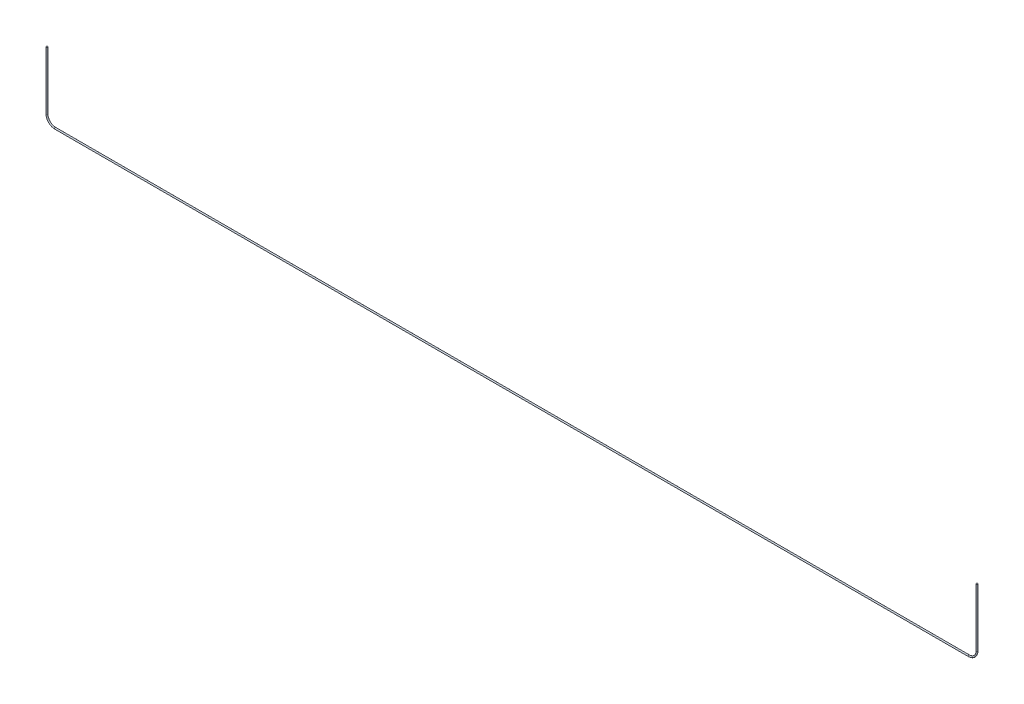
ISO-10303-21;
HEADER;
FILE_DESCRIPTION(('STEP AP214'),'2;1');
FILE_NAME('part.step','',(''),(''),'','','');
FILE_SCHEMA(('AUTOMOTIVE_DESIGN { 1 0 10303 214 1 1 1 1 }'));
ENDSEC;
DATA;
#1=APPLICATION_CONTEXT('core data for automotive mechanical design processes');
#2=APPLICATION_PROTOCOL_DEFINITION('international standard','automotive_design',2000,#1);
#3=PRODUCT_CONTEXT('',#1,'mechanical');
#4=PRODUCT('Part','Part','',(#3));
#5=PRODUCT_RELATED_PRODUCT_CATEGORY('part','',(#4));
#6=PRODUCT_DEFINITION_FORMATION('','',#4);
#7=PRODUCT_DEFINITION_CONTEXT('part definition',#1,'design');
#8=PRODUCT_DEFINITION('design','',#6,#7);
#9=PRODUCT_DEFINITION_SHAPE('','',#8);
#10=(LENGTH_UNIT() NAMED_UNIT(*) SI_UNIT(.MILLI.,.METRE.));
#11=(NAMED_UNIT(*) PLANE_ANGLE_UNIT() SI_UNIT($,.RADIAN.));
#12=(NAMED_UNIT(*) SI_UNIT($,.STERADIAN.) SOLID_ANGLE_UNIT());
#13=UNCERTAINTY_MEASURE_WITH_UNIT(LENGTH_MEASURE(1.E-05),#10,'distance_accuracy_value','');
#14=(GEOMETRIC_REPRESENTATION_CONTEXT(3) GLOBAL_UNCERTAINTY_ASSIGNED_CONTEXT((#13)) GLOBAL_UNIT_ASSIGNED_CONTEXT((#10,
#11,#12)) REPRESENTATION_CONTEXT('',''));
#15=CARTESIAN_POINT('',(0.,0.,0.));
#16=DIRECTION('',(0.,0.,1.));
#17=DIRECTION('',(1.,0.,0.));
#18=AXIS2_PLACEMENT_3D('',#15,#16,#17);
#19=CARTESIAN_POINT('',(4199.9999999998,599.999999999938,-9.2370555648813E-11));
#20=DIRECTION('',(0.,1.,0.));
#21=DIRECTION('',(0.,0.,-1.00000000000001));
#22=AXIS2_PLACEMENT_3D('',#19,#20,#21);
#23=PLANE('',#22);
#24=CARTESIAN_POINT('',(4199.9999999998,599.999999999938,-9.2370555648813E-11));
#25=DIRECTION('',(0.,1.,0.));
#26=DIRECTION('',(0.,0.,-1.00000000000001));
#27=AXIS2_PLACEMENT_3D('',#24,#25,#26);
#28=CIRCLE('',#27,6.3500000000003);
#29=CARTESIAN_POINT('',(4199.9999999998,599.999999999938,-6.35000000009272));
#30=VERTEX_POINT('',#29);
#31=EDGE_CURVE('E75',#30,#30,#28,.T.);
#32=ORIENTED_EDGE('',*,*,#31,.T.);
#33=EDGE_LOOP('',(#32));
#34=FACE_BOUND('',#33,.T.);
#35=ADVANCED_FACE('F46',(#34),#23,.T.);
#36=CARTESIAN_POINT('',(-4199.99999999981,600.000000000074,7.19424519957102E-11));
#37=DIRECTION('',(0.,-1.,0.));
#38=DIRECTION('',(0.,0.,-1.00000000000001));
#39=AXIS2_PLACEMENT_3D('',#36,#37,#38);
#40=PLANE('',#39);
#41=CARTESIAN_POINT('',(-4199.99999999981,600.000000000074,7.19424519957102E-11));
#42=DIRECTION('',(0.,-1.,0.));
#43=DIRECTION('',(0.,0.,-1.00000000000001));
#44=AXIS2_PLACEMENT_3D('',#41,#42,#43);
#45=CIRCLE('',#44,6.3500000000003);
#46=CARTESIAN_POINT('',(-4199.99999999981,600.000000000074,-6.34999999992841));
#47=VERTEX_POINT('',#46);
#48=EDGE_CURVE('E11',#47,#47,#45,.T.);
#49=ORIENTED_EDGE('',*,*,#48,.F.);
#50=EDGE_LOOP('',(#49));
#51=FACE_BOUND('',#50,.T.);
#52=ADVANCED_FACE('F85',(#51),#40,.F.);
#53=CARTESIAN_POINT('',(4199.9999999998,599.999999999938,-9.2370555648813E-11));
#54=DIRECTION('',(0.,-1.,0.));
#55=DIRECTION('',(0.,0.,-1.00000000000001));
#56=AXIS2_PLACEMENT_3D('',#53,#54,#55);
#57=CYLINDRICAL_SURFACE('',#56,6.3500000000003);
#58=CARTESIAN_POINT('',(4199.99999999982,74.999999999931,-8.79296635503124E-11));
#59=DIRECTION('',(0.,1.,0.));
#60=DIRECTION('',(0.,0.,-1.00000000000001));
#61=AXIS2_PLACEMENT_3D('',#58,#59,#60);
#62=CIRCLE('',#61,6.3500000000003);
#63=CARTESIAN_POINT('',(4206.34999999983,74.9999999999317,-8.83056590813193E-11));
#64=VERTEX_POINT('',#63);
#65=EDGE_CURVE('E71',#64,#64,#62,.T.);
#66=ORIENTED_EDGE('',*,*,#65,.T.);
#67=EDGE_LOOP('',(#66));
#68=FACE_BOUND('',#67,.T.);
#69=ORIENTED_EDGE('',*,*,#31,.F.);
#70=EDGE_LOOP('',(#69));
#71=FACE_BOUND('',#70,.T.);
#72=ADVANCED_FACE('F82',(#68,#71),#57,.T.);
#73=CARTESIAN_POINT('',(4124.99999999983,74.9999999999226,-8.34887714518118E-11));
#74=DIRECTION('',(0.,0.,-1.00000000000001));
#75=DIRECTION('',(-0.999999999999959,0.,0.));
#76=AXIS2_PLACEMENT_3D('',#73,#74,#75);
#77=TOROIDAL_SURFACE('',#76,75.0000000000002,6.3500000000003);
#78=CARTESIAN_POINT('',(4124.99999999981,-8.34887714518118E-11,-9.85878045867139E-11));
#79=DIRECTION('',(0.999999999999959,0.,0.));
#80=DIRECTION('',(0.,0.,-1.00000000000001));
#81=AXIS2_PLACEMENT_3D('',#78,#79,#80);
#82=CIRCLE('',#81,6.3500000000003);
#83=CARTESIAN_POINT('',(4124.99999999981,-6.3500000000779,-9.98661893921344E-11));
#84=VERTEX_POINT('',#83);
#85=EDGE_CURVE('E65',#84,#84,#82,.T.);
#86=CARTESIAN_POINT('',(4124.99999999983,74.9999999999226,-8.34887714518118E-11));
#87=DIRECTION('',(0.,0.,-1.00000000000001));
#88=DIRECTION('',(-0.999999999999959,0.,0.));
#89=AXIS2_PLACEMENT_3D('',#86,#87,#88);
#90=CIRCLE('',#89,81.3500000000005);
#91=EDGE_CURVE('',#64,#84,#90,.T.);
#92=ORIENTED_EDGE('',*,*,#65,.F.);
#93=ORIENTED_EDGE('',*,*,#85,.T.);
#94=ORIENTED_EDGE('',*,*,#91,.T.);
#95=ORIENTED_EDGE('',*,*,#91,.F.);
#96=EDGE_LOOP('',(#92,#94,#93,#95));
#97=FACE_BOUND('',#96,.T.);
#98=ADVANCED_FACE('F84',(#97),#77,.T.);
#99=CARTESIAN_POINT('',(4124.99999999981,-8.34887714518118E-11,-9.85878045867139E-11));
#100=DIRECTION('',(-0.999999999999955,0.,0.));
#101=DIRECTION('',(0.,-1.,0.));
#102=AXIS2_PLACEMENT_3D('',#99,#100,#101);
#103=CYLINDRICAL_SURFACE('',#102,6.3500000000003);
#104=CARTESIAN_POINT('',(-4124.99999999981,6.59472476627343E-11,9.41469124882133E-11));
#105=DIRECTION('',(0.999999999999955,0.,0.));
#106=DIRECTION('',(0.,0.,-1.00000000000001));
#107=AXIS2_PLACEMENT_3D('',#104,#105,#106);
#108=CIRCLE('',#107,6.3500000000003);
#109=CARTESIAN_POINT('',(-4124.99999999981,-6.34999999995052,5.94076371429606E-11));
#110=VERTEX_POINT('',#109);
#111=EDGE_CURVE('E59',#110,#110,#108,.T.);
#112=CARTESIAN_POINT('',(-4124.99999999981,-6.34999999995052,5.94076371429606E-11));
#113=CARTESIAN_POINT('',(-4039.06249999981,-6.34999999995191,5.77618182451276E-11));
#114=CARTESIAN_POINT('',(-3953.12499999981,-6.3499999999533,5.61159993472946E-11));
#115=CARTESIAN_POINT('',(-3781.24999999982,-6.34999999995607,5.28243615516286E-11));
#116=CARTESIAN_POINT('',(-3695.31249999983,-6.34999999995746,5.11785426537956E-11));
#117=CARTESIAN_POINT('',(-3523.43749999983,-6.34999999996024,4.78869048581296E-11));
#118=CARTESIAN_POINT('',(-3437.49999999984,-6.34999999996163,4.62410859602966E-11));
#119=CARTESIAN_POINT('',(-3265.62499999985,-6.3499999999644,4.29494481646306E-11));
#120=CARTESIAN_POINT('',(-3179.68749999985,-6.34999999996579,4.13036292667976E-11));
#121=CARTESIAN_POINT('',(-3007.81249999986,-6.34999999996857,3.80119914711317E-11));
#122=CARTESIAN_POINT('',(-2921.87499999986,-6.34999999996995,3.63661725732987E-11));
#123=CARTESIAN_POINT('',(-2749.99999999987,-6.34999999997273,3.30745347776327E-11));
#124=CARTESIAN_POINT('',(-2664.06249999987,-6.34999999997412,3.14287158797997E-11));
#125=CARTESIAN_POINT('',(-2492.18749999988,-6.34999999997689,2.81370780841337E-11));
#126=CARTESIAN_POINT('',(-2406.24999999989,-6.34999999997828,2.64912591863007E-11));
#127=CARTESIAN_POINT('',(-2234.3749999999,-6.34999999998106,2.31996213906347E-11));
#128=CARTESIAN_POINT('',(-2148.4374999999,-6.34999999998245,2.15538024928017E-11));
#129=CARTESIAN_POINT('',(-1976.56249999991,-6.34999999998522,1.82621646971357E-11));
#130=CARTESIAN_POINT('',(-1890.62499999991,-6.34999999998661,1.66163457993027E-11));
#131=CARTESIAN_POINT('',(-1718.74999999992,-6.34999999998939,1.33247080036368E-11));
#132=CARTESIAN_POINT('',(-1632.81249999992,-6.34999999999078,1.16788891058038E-11));
#133=CARTESIAN_POINT('',(-1460.93749999993,-6.34999999999355,8.38725131013778E-12));
#134=CARTESIAN_POINT('',(-1374.99999999994,-6.34999999999494,6.7414324123048E-12));
#135=CARTESIAN_POINT('',(-1203.12499999994,-6.34999999999772,3.44979461663881E-12));
#136=CARTESIAN_POINT('',(-1117.18749999995,-6.34999999999911,1.80397571880582E-12));
#137=CARTESIAN_POINT('',(-945.312499999955,-6.35000000000188,-1.48766207686018E-12));
#138=CARTESIAN_POINT('',(-859.374999999959,-6.35000000000327,-3.13348097469317E-12));
#139=CARTESIAN_POINT('',(-687.499999999967,-6.35000000000605,-6.42511877035916E-12));
#140=CARTESIAN_POINT('',(-601.562499999971,-6.35000000000743,-8.07093766819215E-12));
#141=CARTESIAN_POINT('',(-429.687499999979,-6.35000000001021,-1.13625754638581E-11));
#142=CARTESIAN_POINT('',(-343.749999999983,-6.3500000000116,-1.30083943616911E-11));
#143=CARTESIAN_POINT('',(-171.874999999991,-6.35000000001438,-1.63000321573571E-11));
#144=CARTESIAN_POINT('',(-85.9374999999953,-6.35000000001576,-1.79458510551901E-11));
#145=CARTESIAN_POINT('',(85.9374999999972,-6.35000000001854,-2.12374888508561E-11));
#146=CARTESIAN_POINT('',(171.874999999993,-6.35000000001993,-2.28833077486891E-11));
#147=CARTESIAN_POINT('',(343.749999999986,-6.35000000002271,-2.61749455443551E-11));
#148=CARTESIAN_POINT('',(429.687499999982,-6.35000000002409,-2.78207644421881E-11));
#149=CARTESIAN_POINT('',(601.562499999973,-6.35000000002687,-3.1112402237854E-11));
#150=CARTESIAN_POINT('',(687.499999999969,-6.35000000002826,-3.2758221135687E-11));
#151=CARTESIAN_POINT('',(859.374999999961,-6.35000000003104,-3.6049858931353E-11));
#152=CARTESIAN_POINT('',(945.312499999957,-6.35000000003242,-3.7695677829186E-11));
#153=CARTESIAN_POINT('',(1117.18749999995,-6.3500000000352,-4.0987315624852E-11));
#154=CARTESIAN_POINT('',(1203.12499999995,-6.35000000003659,-4.2633134522685E-11));
#155=CARTESIAN_POINT('',(1374.99999999994,-6.35000000003936,-4.5924772318351E-11));
#156=CARTESIAN_POINT('',(1460.93749999993,-6.35000000004075,-4.7570591216184E-11));
#157=CARTESIAN_POINT('',(1632.81249999992,-6.35000000004353,-5.086222901185E-11));
#158=CARTESIAN_POINT('',(1718.74999999992,-6.35000000004492,-5.2508047909683E-11));
#159=CARTESIAN_POINT('',(1890.62499999991,-6.35000000004769,-5.57996857053489E-11));
#160=CARTESIAN_POINT('',(1976.56249999991,-6.35000000004908,-5.74455046031819E-11));
#161=CARTESIAN_POINT('',(2148.4374999999,-6.35000000005186,-6.07371423988479E-11));
#162=CARTESIAN_POINT('',(2234.3749999999,-6.35000000005325,-6.23829612966809E-11));
#163=CARTESIAN_POINT('',(2406.24999999989,-6.35000000005602,-6.56745990923469E-11));
#164=CARTESIAN_POINT('',(2492.18749999988,-6.35000000005741,-6.73204179901799E-11));
#165=CARTESIAN_POINT('',(2664.06249999988,-6.35000000006019,-7.06120557858459E-11));
#166=CARTESIAN_POINT('',(2749.99999999987,-6.35000000006158,-7.22578746836789E-11));
#167=CARTESIAN_POINT('',(2921.87499999986,-6.35000000006435,-7.55495124793449E-11));
#168=CARTESIAN_POINT('',(3007.81249999986,-6.35000000006574,-7.71953313771779E-11));
#169=CARTESIAN_POINT('',(3179.68749999985,-6.35000000006852,-8.04869691728438E-11));
#170=CARTESIAN_POINT('',(3265.62499999985,-6.3500000000699,-8.21327880706768E-11));
#171=CARTESIAN_POINT('',(3437.49999999984,-6.35000000007268,-8.54244258663428E-11));
#172=CARTESIAN_POINT('',(3523.43749999984,-6.35000000007407,-8.70702447641758E-11));
#173=CARTESIAN_POINT('',(3695.31249999983,-6.35000000007685,-9.03618825598418E-11));
#174=CARTESIAN_POINT('',(3781.24999999982,-6.35000000007823,-9.20077014576748E-11));
#175=CARTESIAN_POINT('',(3953.12499999982,-6.35000000008101,-9.52993392533408E-11));
#176=CARTESIAN_POINT('',(4039.06249999981,-6.3500000000824,-9.69451581511738E-11));
#177=CARTESIAN_POINT('',(4124.99999999981,-6.35000000008379,-9.85909770490068E-11));
#178=B_SPLINE_CURVE_WITH_KNOTS('',3,(#112,#113,#114,#115,#116,#117,#118,#119,#120,#121,#122,
#123,#124,#125,#126,#127,#128,#129,#130,#131,#132,#133,#134,#135,#136,#137,#138,#139,#140,#141,
#142,#143,#144,#145,#146,#147,#148,#149,#150,#151,#152,#153,#154,#155,#156,#157,#158,#159,#160,
#161,#162,#163,#164,#165,#166,#167,#168,#169,#170,#171,#172,#173,#174,#175,#176,#177),
.UNSPECIFIED.,.F.,.F.,(4,2,2,2,2,2,2,2,2,2,2,2,2,2,2,2,2,2,2,2,2,2,2,2,2,2,2,2,2,2,2,2,4),(0.,
257.812499999989,515.624999999977,773.437499999965,1031.24999999995,1289.06249999994,
1546.87499999993,1804.68749999992,2062.4999999999,2320.31249999989,2578.12499999988,
2835.93749999987,3093.74999999986,3351.56249999984,3609.37499999983,3867.18749999982,
4124.99999999981,4382.8124999998,4640.62499999979,4898.43749999977,5156.24999999976,
5414.06249999975,5671.87499999974,5929.68749999972,6187.49999999971,6445.3124999997,
6703.12499999969,6960.93749999968,7218.74999999966,7476.56249999965,7734.37499999964,
7992.18749999963,8249.99999999962),.UNSPECIFIED.);
#179=EDGE_CURVE('BSEAM92',#110,#84,#178,.T.);
#180=ORIENTED_EDGE('',*,*,#111,.T.);
#181=ORIENTED_EDGE('',*,*,#85,.F.);
#182=ORIENTED_EDGE('',*,*,#179,.T.);
#183=ORIENTED_EDGE('',*,*,#179,.F.);
#184=EDGE_LOOP('',(#180,#182,#181,#183));
#185=FACE_BOUND('',#184,.T.);
#186=ADVANCED_FACE('F92',(#185),#103,.T.);
#187=CARTESIAN_POINT('',(-4124.9999999998,75.0000000000772,8.70414851306123E-11));
#188=DIRECTION('',(0.,0.,-1.00000000000001));
#189=DIRECTION('',(-0.999999999999959,0.,0.));
#190=AXIS2_PLACEMENT_3D('',#187,#188,#189);
#191=TOROIDAL_SURFACE('',#190,74.9999999999999,6.3500000000003);
#192=CARTESIAN_POINT('',(-4199.99999999982,75.0000000000885,8.26005930321116E-11));
#193=DIRECTION('',(0.,-1.,0.));
#194=DIRECTION('',(0.,0.,-1.00000000000001));
#195=AXIS2_PLACEMENT_3D('',#192,#193,#194);
#196=CIRCLE('',#195,6.3500000000003);
#197=CARTESIAN_POINT('',(-4206.3499999998,75.0000000000895,8.22245975011065E-11));
#198=VERTEX_POINT('',#197);
#199=EDGE_CURVE('E53',#198,#198,#196,.T.);
#200=CARTESIAN_POINT('',(-4124.9999999998,75.0000000000772,8.70414851306123E-11));
#201=DIRECTION('',(0.,0.,-1.00000000000001));
#202=DIRECTION('',(-0.999999999999959,0.,0.));
#203=AXIS2_PLACEMENT_3D('',#200,#201,#202);
#204=CIRCLE('',#203,81.3500000000002);
#205=EDGE_CURVE('',#110,#198,#204,.T.);
#206=ORIENTED_EDGE('',*,*,#111,.F.);
#207=ORIENTED_EDGE('',*,*,#199,.T.);
#208=ORIENTED_EDGE('',*,*,#205,.T.);
#209=ORIENTED_EDGE('',*,*,#205,.F.);
#210=EDGE_LOOP('',(#206,#208,#207,#209));
#211=FACE_BOUND('',#210,.T.);
#212=ADVANCED_FACE('F98',(#211),#191,.T.);
#213=CARTESIAN_POINT('',(-4199.99999999982,75.0000000000885,8.26005930321116E-11));
#214=DIRECTION('',(0.,1.,0.));
#215=DIRECTION('',(0.,0.,1.00000000000001));
#216=AXIS2_PLACEMENT_3D('',#213,#214,#215);
#217=CYLINDRICAL_SURFACE('',#216,6.3500000000003);
#218=ORIENTED_EDGE('',*,*,#48,.T.);
#219=EDGE_LOOP('',(#218));
#220=FACE_BOUND('',#219,.T.);
#221=ORIENTED_EDGE('',*,*,#199,.F.);
#222=EDGE_LOOP('',(#221));
#223=FACE_BOUND('',#222,.T.);
#224=ADVANCED_FACE('F96',(#220,#223),#217,.T.);
#225=CLOSED_SHELL('',(#35,#52,#72,#98,#186,#212,#224));
#226=MANIFOLD_SOLID_BREP('B2',#225);
#227=ADVANCED_BREP_SHAPE_REPRESENTATION('',(#18,#226),#14);
#228=SHAPE_DEFINITION_REPRESENTATION(#9,#227);
ENDSEC;
END-ISO-10303-21;
